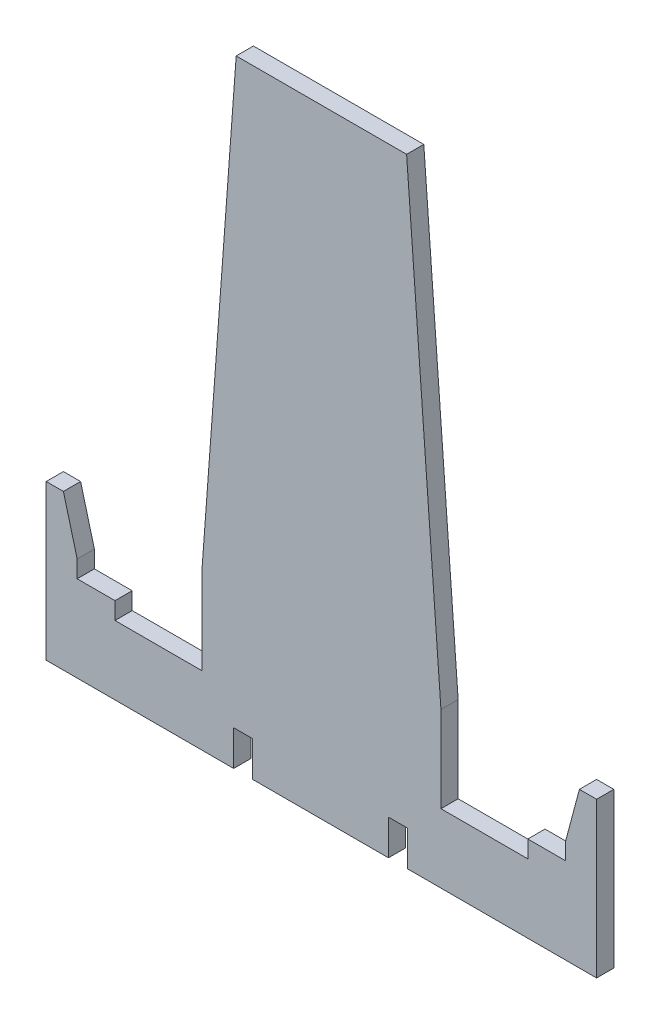
ISO-10303-21;
HEADER;
FILE_DESCRIPTION(('STEP AP214'),'2;1');
FILE_NAME('part.step','',(''),(''),'','','');
FILE_SCHEMA(('AUTOMOTIVE_DESIGN { 1 0 10303 214 1 1 1 1 }'));
ENDSEC;
DATA;
#1=APPLICATION_CONTEXT('core data for automotive mechanical design processes');
#2=APPLICATION_PROTOCOL_DEFINITION('international standard','automotive_design',2000,#1);
#3=PRODUCT_CONTEXT('',#1,'mechanical');
#4=PRODUCT('Part','Part','',(#3));
#5=PRODUCT_RELATED_PRODUCT_CATEGORY('part','',(#4));
#6=PRODUCT_DEFINITION_FORMATION('','',#4);
#7=PRODUCT_DEFINITION_CONTEXT('part definition',#1,'design');
#8=PRODUCT_DEFINITION('design','',#6,#7);
#9=PRODUCT_DEFINITION_SHAPE('','',#8);
#10=(LENGTH_UNIT() NAMED_UNIT(*) SI_UNIT(.MILLI.,.METRE.));
#11=(NAMED_UNIT(*) PLANE_ANGLE_UNIT() SI_UNIT($,.RADIAN.));
#12=(NAMED_UNIT(*) SI_UNIT($,.STERADIAN.) SOLID_ANGLE_UNIT());
#13=UNCERTAINTY_MEASURE_WITH_UNIT(LENGTH_MEASURE(1.E-05),#10,'distance_accuracy_value','');
#14=(GEOMETRIC_REPRESENTATION_CONTEXT(3) GLOBAL_UNCERTAINTY_ASSIGNED_CONTEXT((#13)) GLOBAL_UNIT_ASSIGNED_CONTEXT((#10,
#11,#12)) REPRESENTATION_CONTEXT('',''));
#15=CARTESIAN_POINT('',(0.,0.,0.));
#16=DIRECTION('',(0.,0.,1.));
#17=DIRECTION('',(1.,0.,0.));
#18=AXIS2_PLACEMENT_3D('',#15,#16,#17);
#19=CARTESIAN_POINT('',(-641.00297554201,-133.729086598929,2.5));
#20=DIRECTION('',(1.,0.,0.));
#21=DIRECTION('',(0.,0.,-1.));
#22=AXIS2_PLACEMENT_3D('',#19,#20,#21);
#23=PLANE('',#22);
#24=DIRECTION('',(0.,-1.,0.));
#25=VECTOR('',#24,1.);
#26=CARTESIAN_POINT('',(-641.00297554201,-133.729086598929,-2.5));
#27=LINE('',#26,#25);
#28=CARTESIAN_POINT('',(-641.00297554201,-108.738333191602,-2.5));
#29=VERTEX_POINT('',#28);
#30=CARTESIAN_POINT('',(-641.00297554201,-133.729086598929,-2.5));
#31=VERTEX_POINT('',#30);
#32=EDGE_CURVE('E249',#29,#31,#27,.T.);
#33=ORIENTED_EDGE('',*,*,#32,.T.);
#34=DIRECTION('',(0.,0.,-1.));
#35=VECTOR('',#34,1.);
#36=CARTESIAN_POINT('',(-641.00297554201,-133.729086598929,2.5));
#37=LINE('',#36,#35);
#38=CARTESIAN_POINT('',(-641.00297554201,-133.729086598929,2.5));
#39=VERTEX_POINT('',#38);
#40=EDGE_CURVE('E11',#39,#31,#37,.T.);
#41=ORIENTED_EDGE('',*,*,#40,.F.);
#42=DIRECTION('',(0.,-1.,0.));
#43=VECTOR('',#42,1.);
#44=CARTESIAN_POINT('',(-641.00297554201,-133.729086598929,2.5));
#45=LINE('',#44,#43);
#46=CARTESIAN_POINT('',(-641.00297554201,-108.738333191602,2.5));
#47=VERTEX_POINT('',#46);
#48=EDGE_CURVE('E303',#47,#39,#45,.T.);
#49=ORIENTED_EDGE('',*,*,#48,.F.);
#50=DIRECTION('',(0.,0.,-1.));
#51=VECTOR('',#50,1.);
#52=CARTESIAN_POINT('',(-641.00297554201,-108.738333191602,2.5));
#53=LINE('',#52,#51);
#54=EDGE_CURVE('E245',#47,#29,#53,.T.);
#55=ORIENTED_EDGE('',*,*,#54,.T.);
#56=EDGE_LOOP('',(#33,#41,#49,#55));
#57=FACE_BOUND('',#56,.T.);
#58=ADVANCED_FACE('F33',(#57),#23,.F.);
#59=CARTESIAN_POINT('',(-641.00297554201,-133.729086598929,2.5));
#60=DIRECTION('',(0.,-1.,0.));
#61=DIRECTION('',(0.,0.,-1.));
#62=AXIS2_PLACEMENT_3D('',#59,#60,#61);
#63=PLANE('',#62);
#64=DIRECTION('',(-1.,0.,0.));
#65=VECTOR('',#64,1.);
#66=CARTESIAN_POINT('',(-641.00297554201,-133.729086598929,-2.5));
#67=LINE('',#66,#65);
#68=CARTESIAN_POINT('',(-666.252975542009,-133.729086598929,-2.5));
#69=VERTEX_POINT('',#68);
#70=EDGE_CURVE('E252',#31,#69,#67,.T.);
#71=ORIENTED_EDGE('',*,*,#70,.T.);
#72=DIRECTION('',(0.,0.,-1.));
#73=VECTOR('',#72,1.);
#74=CARTESIAN_POINT('',(-666.252975542009,-133.729086598929,2.5));
#75=LINE('',#74,#73);
#76=CARTESIAN_POINT('',(-666.252975542009,-133.729086598929,2.5));
#77=VERTEX_POINT('',#76);
#78=EDGE_CURVE('E41',#77,#69,#75,.T.);
#79=ORIENTED_EDGE('',*,*,#78,.F.);
#80=DIRECTION('',(-1.,0.,0.));
#81=VECTOR('',#80,1.);
#82=CARTESIAN_POINT('',(-641.00297554201,-133.729086598929,2.5));
#83=LINE('',#82,#81);
#84=EDGE_CURVE('E152',#39,#77,#83,.T.);
#85=ORIENTED_EDGE('',*,*,#84,.F.);
#86=ORIENTED_EDGE('',*,*,#40,.T.);
#87=EDGE_LOOP('',(#71,#79,#85,#86));
#88=FACE_BOUND('',#87,.T.);
#89=ADVANCED_FACE('F461',(#88),#63,.F.);
#90=CARTESIAN_POINT('',(-666.252975542009,-133.729086598929,2.5));
#91=DIRECTION('',(-1.,0.,0.));
#92=DIRECTION('',(0.,0.,1.));
#93=AXIS2_PLACEMENT_3D('',#90,#91,#92);
#94=PLANE('',#93);
#95=DIRECTION('',(0.,1.,0.));
#96=VECTOR('',#95,1.);
#97=CARTESIAN_POINT('',(-666.252975542009,-133.729086598929,-2.5));
#98=LINE('',#97,#96);
#99=CARTESIAN_POINT('',(-666.252975542009,-128.729086598929,-2.5));
#100=VERTEX_POINT('',#99);
#101=EDGE_CURVE('E254',#69,#100,#98,.T.);
#102=ORIENTED_EDGE('',*,*,#101,.T.);
#103=DIRECTION('',(0.,0.,-1.));
#104=VECTOR('',#103,1.);
#105=CARTESIAN_POINT('',(-666.252975542009,-128.729086598929,2.5));
#106=LINE('',#105,#104);
#107=CARTESIAN_POINT('',(-666.252975542009,-128.729086598929,2.5));
#108=VERTEX_POINT('',#107);
#109=EDGE_CURVE('E370',#108,#100,#106,.T.);
#110=ORIENTED_EDGE('',*,*,#109,.F.);
#111=DIRECTION('',(0.,1.,0.));
#112=VECTOR('',#111,1.);
#113=CARTESIAN_POINT('',(-666.252975542009,-133.729086598929,2.5));
#114=LINE('',#113,#112);
#115=EDGE_CURVE('E378',#77,#108,#114,.T.);
#116=ORIENTED_EDGE('',*,*,#115,.F.);
#117=ORIENTED_EDGE('',*,*,#78,.T.);
#118=EDGE_LOOP('',(#102,#110,#116,#117));
#119=FACE_BOUND('',#118,.T.);
#120=ADVANCED_FACE('F376',(#119),#94,.F.);
#121=CARTESIAN_POINT('',(-666.252975542009,-128.729086598929,2.5));
#122=DIRECTION('',(0.,-1.,0.));
#123=DIRECTION('',(0.,0.,-1.));
#124=AXIS2_PLACEMENT_3D('',#121,#122,#123);
#125=PLANE('',#124);
#126=DIRECTION('',(-1.,0.,0.));
#127=VECTOR('',#126,1.);
#128=CARTESIAN_POINT('',(-666.252975542009,-128.729086598929,-2.5));
#129=LINE('',#128,#127);
#130=CARTESIAN_POINT('',(-677.252975542009,-128.729086598929,-2.5));
#131=VERTEX_POINT('',#130);
#132=EDGE_CURVE('E256',#100,#131,#129,.T.);
#133=ORIENTED_EDGE('',*,*,#132,.T.);
#134=DIRECTION('',(0.,0.,-1.));
#135=VECTOR('',#134,1.);
#136=CARTESIAN_POINT('',(-677.252975542009,-128.729086598929,2.5));
#137=LINE('',#136,#135);
#138=CARTESIAN_POINT('',(-677.252975542009,-128.729086598929,2.5));
#139=VERTEX_POINT('',#138);
#140=EDGE_CURVE('E367',#139,#131,#137,.T.);
#141=ORIENTED_EDGE('',*,*,#140,.F.);
#142=DIRECTION('',(-1.,0.,0.));
#143=VECTOR('',#142,1.);
#144=CARTESIAN_POINT('',(-666.252975542009,-128.729086598929,2.5));
#145=LINE('',#144,#143);
#146=EDGE_CURVE('E396',#108,#139,#145,.T.);
#147=ORIENTED_EDGE('',*,*,#146,.F.);
#148=ORIENTED_EDGE('',*,*,#109,.T.);
#149=EDGE_LOOP('',(#133,#141,#147,#148));
#150=FACE_BOUND('',#149,.T.);
#151=ADVANCED_FACE('F387',(#150),#125,.F.);
#152=CARTESIAN_POINT('',(-677.252975542009,-128.729086598929,2.5));
#153=DIRECTION('',(-1.,0.,0.));
#154=DIRECTION('',(0.,0.,1.));
#155=AXIS2_PLACEMENT_3D('',#152,#153,#154);
#156=PLANE('',#155);
#157=DIRECTION('',(0.,1.,0.));
#158=VECTOR('',#157,1.);
#159=CARTESIAN_POINT('',(-677.252975542009,-128.729086598929,-2.5));
#160=LINE('',#159,#158);
#161=CARTESIAN_POINT('',(-677.252975542009,-123.72908659893,-2.5));
#162=VERTEX_POINT('',#161);
#163=EDGE_CURVE('E258',#131,#162,#160,.T.);
#164=ORIENTED_EDGE('',*,*,#163,.T.);
#165=DIRECTION('',(0.,0.,-1.));
#166=VECTOR('',#165,1.);
#167=CARTESIAN_POINT('',(-677.252975542009,-123.72908659893,2.5));
#168=LINE('',#167,#166);
#169=CARTESIAN_POINT('',(-677.252975542009,-123.72908659893,2.5));
#170=VERTEX_POINT('',#169);
#171=EDGE_CURVE('E364',#170,#162,#168,.T.);
#172=ORIENTED_EDGE('',*,*,#171,.F.);
#173=DIRECTION('',(0.,1.,0.));
#174=VECTOR('',#173,1.);
#175=CARTESIAN_POINT('',(-677.252975542009,-128.729086598929,2.5));
#176=LINE('',#175,#174);
#177=EDGE_CURVE('E393',#139,#170,#176,.T.);
#178=ORIENTED_EDGE('',*,*,#177,.F.);
#179=ORIENTED_EDGE('',*,*,#140,.T.);
#180=EDGE_LOOP('',(#164,#172,#178,#179));
#181=FACE_BOUND('',#180,.T.);
#182=ADVANCED_FACE('F391',(#181),#156,.F.);
#183=CARTESIAN_POINT('',(-677.252975542009,-123.72908659893,2.5));
#184=DIRECTION('',(-0.966234939601239,-0.25766265056036,0.));
#185=DIRECTION('',(0.25766265056036,-0.966234939601239,0.));
#186=AXIS2_PLACEMENT_3D('',#183,#184,#185);
#187=PLANE('',#186);
#188=DIRECTION('',(-0.25766265056036,0.966234939601239,0.));
#189=VECTOR('',#188,1.);
#190=CARTESIAN_POINT('',(-677.252975542009,-123.72908659893,-2.5));
#191=LINE('',#190,#189);
#192=CARTESIAN_POINT('',(-681.25297554201,-108.729086598929,-2.5));
#193=VERTEX_POINT('',#192);
#194=EDGE_CURVE('E260',#162,#193,#191,.T.);
#195=ORIENTED_EDGE('',*,*,#194,.T.);
#196=DIRECTION('',(0.,0.,-1.));
#197=VECTOR('',#196,1.);
#198=CARTESIAN_POINT('',(-681.25297554201,-108.729086598929,2.5));
#199=LINE('',#198,#197);
#200=CARTESIAN_POINT('',(-681.25297554201,-108.729086598929,2.5));
#201=VERTEX_POINT('',#200);
#202=EDGE_CURVE('E361',#201,#193,#199,.T.);
#203=ORIENTED_EDGE('',*,*,#202,.F.);
#204=DIRECTION('',(-0.25766265056036,0.966234939601239,0.));
#205=VECTOR('',#204,1.);
#206=CARTESIAN_POINT('',(-677.252975542009,-123.72908659893,2.5));
#207=LINE('',#206,#205);
#208=EDGE_CURVE('E395',#170,#201,#207,.T.);
#209=ORIENTED_EDGE('',*,*,#208,.F.);
#210=ORIENTED_EDGE('',*,*,#171,.T.);
#211=EDGE_LOOP('',(#195,#203,#209,#210));
#212=FACE_BOUND('',#211,.T.);
#213=ADVANCED_FACE('F474',(#212),#187,.F.);
#214=CARTESIAN_POINT('',(-681.25297554201,-108.729086598929,2.5));
#215=DIRECTION('',(0.,-1.,0.));
#216=DIRECTION('',(0.,0.,-1.));
#217=AXIS2_PLACEMENT_3D('',#214,#215,#216);
#218=PLANE('',#217);
#219=DIRECTION('',(-1.,0.,0.));
#220=VECTOR('',#219,1.);
#221=CARTESIAN_POINT('',(-681.25297554201,-108.729086598929,-2.5));
#222=LINE('',#221,#220);
#223=CARTESIAN_POINT('',(-686.25297554201,-108.729086598929,-2.5));
#224=VERTEX_POINT('',#223);
#225=EDGE_CURVE('E262',#193,#224,#222,.T.);
#226=ORIENTED_EDGE('',*,*,#225,.T.);
#227=DIRECTION('',(0.,0.,-1.));
#228=VECTOR('',#227,1.);
#229=CARTESIAN_POINT('',(-686.25297554201,-108.729086598929,2.5));
#230=LINE('',#229,#228);
#231=CARTESIAN_POINT('',(-686.25297554201,-108.729086598929,2.5));
#232=VERTEX_POINT('',#231);
#233=EDGE_CURVE('E358',#232,#224,#230,.T.);
#234=ORIENTED_EDGE('',*,*,#233,.F.);
#235=DIRECTION('',(-1.,0.,0.));
#236=VECTOR('',#235,1.);
#237=CARTESIAN_POINT('',(-681.25297554201,-108.729086598929,2.5));
#238=LINE('',#237,#236);
#239=EDGE_CURVE('E398',#201,#232,#238,.T.);
#240=ORIENTED_EDGE('',*,*,#239,.F.);
#241=ORIENTED_EDGE('',*,*,#202,.T.);
#242=EDGE_LOOP('',(#226,#234,#240,#241));
#243=FACE_BOUND('',#242,.T.);
#244=ADVANCED_FACE('F477',(#243),#218,.F.);
#245=CARTESIAN_POINT('',(-686.25297554201,-108.729086598929,2.5));
#246=DIRECTION('',(1.,0.,0.));
#247=DIRECTION('',(0.,0.,-1.));
#248=AXIS2_PLACEMENT_3D('',#245,#246,#247);
#249=PLANE('',#248);
#250=DIRECTION('',(0.,-1.,0.));
#251=VECTOR('',#250,1.);
#252=CARTESIAN_POINT('',(-686.25297554201,-108.729086598929,-2.5));
#253=LINE('',#252,#251);
#254=CARTESIAN_POINT('',(-686.25297554201,-153.729086598929,-2.5));
#255=VERTEX_POINT('',#254);
#256=EDGE_CURVE('E264',#224,#255,#253,.T.);
#257=ORIENTED_EDGE('',*,*,#256,.T.);
#258=DIRECTION('',(0.,0.,-1.));
#259=VECTOR('',#258,1.);
#260=CARTESIAN_POINT('',(-686.25297554201,-153.729086598929,2.5));
#261=LINE('',#260,#259);
#262=CARTESIAN_POINT('',(-686.25297554201,-153.729086598929,2.5));
#263=VERTEX_POINT('',#262);
#264=EDGE_CURVE('E355',#263,#255,#261,.T.);
#265=ORIENTED_EDGE('',*,*,#264,.F.);
#266=DIRECTION('',(0.,-1.,0.));
#267=VECTOR('',#266,1.);
#268=CARTESIAN_POINT('',(-686.25297554201,-108.729086598929,2.5));
#269=LINE('',#268,#267);
#270=EDGE_CURVE('E404',#232,#263,#269,.T.);
#271=ORIENTED_EDGE('',*,*,#270,.F.);
#272=ORIENTED_EDGE('',*,*,#233,.T.);
#273=EDGE_LOOP('',(#257,#265,#271,#272));
#274=FACE_BOUND('',#273,.T.);
#275=ADVANCED_FACE('F481',(#274),#249,.F.);
#276=CARTESIAN_POINT('',(-686.25297554201,-153.729086598929,2.5));
#277=DIRECTION('',(0.,1.,0.));
#278=DIRECTION('',(0.,0.,1.));
#279=AXIS2_PLACEMENT_3D('',#276,#277,#278);
#280=PLANE('',#279);
#281=DIRECTION('',(1.,0.,0.));
#282=VECTOR('',#281,1.);
#283=CARTESIAN_POINT('',(-686.25297554201,-153.729086598929,-2.5));
#284=LINE('',#283,#282);
#285=CARTESIAN_POINT('',(-631.752975542009,-153.729086598929,-2.5));
#286=VERTEX_POINT('',#285);
#287=EDGE_CURVE('E266',#255,#286,#284,.T.);
#288=ORIENTED_EDGE('',*,*,#287,.T.);
#289=DIRECTION('',(0.,0.,-1.));
#290=VECTOR('',#289,1.);
#291=CARTESIAN_POINT('',(-631.752975542009,-153.729086598929,2.5));
#292=LINE('',#291,#290);
#293=CARTESIAN_POINT('',(-631.752975542009,-153.729086598929,2.5));
#294=VERTEX_POINT('',#293);
#295=EDGE_CURVE('E352',#294,#286,#292,.T.);
#296=ORIENTED_EDGE('',*,*,#295,.F.);
#297=DIRECTION('',(1.,0.,0.));
#298=VECTOR('',#297,1.);
#299=CARTESIAN_POINT('',(-686.25297554201,-153.729086598929,2.5));
#300=LINE('',#299,#298);
#301=EDGE_CURVE('E406',#263,#294,#300,.T.);
#302=ORIENTED_EDGE('',*,*,#301,.F.);
#303=ORIENTED_EDGE('',*,*,#264,.T.);
#304=EDGE_LOOP('',(#288,#296,#302,#303));
#305=FACE_BOUND('',#304,.T.);
#306=ADVANCED_FACE('F485',(#305),#280,.F.);
#307=CARTESIAN_POINT('',(-631.752975542009,-143.479086598928,2.5));
#308=DIRECTION('',(-1.,0.,0.));
#309=DIRECTION('',(0.,0.,1.));
#310=AXIS2_PLACEMENT_3D('',#307,#308,#309);
#311=PLANE('',#310);
#312=DIRECTION('',(0.,1.,0.));
#313=VECTOR('',#312,1.);
#314=CARTESIAN_POINT('',(-631.752975542009,-143.479086598928,-2.5));
#315=LINE('',#314,#313);
#316=CARTESIAN_POINT('',(-631.752975542009,-143.479086598928,-2.5));
#317=VERTEX_POINT('',#316);
#318=EDGE_CURVE('E268',#286,#317,#315,.T.);
#319=ORIENTED_EDGE('',*,*,#318,.T.);
#320=DIRECTION('',(0.,0.,-1.));
#321=VECTOR('',#320,1.);
#322=CARTESIAN_POINT('',(-631.752975542009,-143.479086598928,2.5));
#323=LINE('',#322,#321);
#324=CARTESIAN_POINT('',(-631.752975542009,-143.479086598928,2.5));
#325=VERTEX_POINT('',#324);
#326=EDGE_CURVE('E349',#325,#317,#323,.T.);
#327=ORIENTED_EDGE('',*,*,#326,.F.);
#328=DIRECTION('',(0.,1.,0.));
#329=VECTOR('',#328,1.);
#330=CARTESIAN_POINT('',(-631.752975542009,-143.479086598928,2.5));
#331=LINE('',#330,#329);
#332=EDGE_CURVE('E408',#294,#325,#331,.T.);
#333=ORIENTED_EDGE('',*,*,#332,.F.);
#334=ORIENTED_EDGE('',*,*,#295,.T.);
#335=EDGE_LOOP('',(#319,#327,#333,#334));
#336=FACE_BOUND('',#335,.T.);
#337=ADVANCED_FACE('F489',(#336),#311,.F.);
#338=CARTESIAN_POINT('',(-626.252975542008,-143.479086598928,2.5));
#339=DIRECTION('',(0.,1.,0.));
#340=DIRECTION('',(0.,0.,1.));
#341=AXIS2_PLACEMENT_3D('',#338,#339,#340);
#342=PLANE('',#341);
#343=DIRECTION('',(1.,0.,0.));
#344=VECTOR('',#343,1.);
#345=CARTESIAN_POINT('',(-626.252975542008,-143.479086598928,-2.5));
#346=LINE('',#345,#344);
#347=CARTESIAN_POINT('',(-626.252975542008,-143.479086598928,-2.5));
#348=VERTEX_POINT('',#347);
#349=EDGE_CURVE('E270',#317,#348,#346,.T.);
#350=ORIENTED_EDGE('',*,*,#349,.T.);
#351=DIRECTION('',(0.,0.,-1.));
#352=VECTOR('',#351,1.);
#353=CARTESIAN_POINT('',(-626.252975542008,-143.479086598928,2.5));
#354=LINE('',#353,#352);
#355=CARTESIAN_POINT('',(-626.252975542008,-143.479086598928,2.5));
#356=VERTEX_POINT('',#355);
#357=EDGE_CURVE('E346',#356,#348,#354,.T.);
#358=ORIENTED_EDGE('',*,*,#357,.F.);
#359=DIRECTION('',(1.,0.,0.));
#360=VECTOR('',#359,1.);
#361=CARTESIAN_POINT('',(-626.252975542008,-143.479086598928,2.5));
#362=LINE('',#361,#360);
#363=EDGE_CURVE('E410',#325,#356,#362,.T.);
#364=ORIENTED_EDGE('',*,*,#363,.F.);
#365=ORIENTED_EDGE('',*,*,#326,.T.);
#366=EDGE_LOOP('',(#350,#358,#364,#365));
#367=FACE_BOUND('',#366,.T.);
#368=ADVANCED_FACE('F493',(#367),#342,.F.);
#369=CARTESIAN_POINT('',(-626.252975542008,-153.729086598929,2.5));
#370=DIRECTION('',(1.,0.,0.));
#371=DIRECTION('',(0.,0.,-1.));
#372=AXIS2_PLACEMENT_3D('',#369,#370,#371);
#373=PLANE('',#372);
#374=DIRECTION('',(0.,-1.,0.));
#375=VECTOR('',#374,1.);
#376=CARTESIAN_POINT('',(-626.252975542008,-153.729086598929,-2.5));
#377=LINE('',#376,#375);
#378=CARTESIAN_POINT('',(-626.252975542008,-153.729086598929,-2.5));
#379=VERTEX_POINT('',#378);
#380=EDGE_CURVE('E272',#348,#379,#377,.T.);
#381=ORIENTED_EDGE('',*,*,#380,.T.);
#382=DIRECTION('',(0.,0.,-1.));
#383=VECTOR('',#382,1.);
#384=CARTESIAN_POINT('',(-626.252975542008,-153.729086598929,2.5));
#385=LINE('',#384,#383);
#386=CARTESIAN_POINT('',(-626.252975542008,-153.729086598929,2.5));
#387=VERTEX_POINT('',#386);
#388=EDGE_CURVE('E343',#387,#379,#385,.T.);
#389=ORIENTED_EDGE('',*,*,#388,.F.);
#390=DIRECTION('',(0.,-1.,0.));
#391=VECTOR('',#390,1.);
#392=CARTESIAN_POINT('',(-626.252975542008,-153.729086598929,2.5));
#393=LINE('',#392,#391);
#394=EDGE_CURVE('E412',#356,#387,#393,.T.);
#395=ORIENTED_EDGE('',*,*,#394,.F.);
#396=ORIENTED_EDGE('',*,*,#357,.T.);
#397=EDGE_LOOP('',(#381,#389,#395,#396));
#398=FACE_BOUND('',#397,.T.);
#399=ADVANCED_FACE('F497',(#398),#373,.F.);
#400=CARTESIAN_POINT('',(-626.252975542008,-153.729086598929,2.5));
#401=DIRECTION('',(0.,1.,0.));
#402=DIRECTION('',(0.,0.,1.));
#403=AXIS2_PLACEMENT_3D('',#400,#401,#402);
#404=PLANE('',#403);
#405=DIRECTION('',(1.,0.,0.));
#406=VECTOR('',#405,1.);
#407=CARTESIAN_POINT('',(-626.252975542008,-153.729086598929,-2.5));
#408=LINE('',#407,#406);
#409=CARTESIAN_POINT('',(-586.752975542011,-153.729086598929,-2.5));
#410=VERTEX_POINT('',#409);
#411=EDGE_CURVE('E274',#379,#410,#408,.T.);
#412=ORIENTED_EDGE('',*,*,#411,.T.);
#413=DIRECTION('',(0.,0.,-1.));
#414=VECTOR('',#413,1.);
#415=CARTESIAN_POINT('',(-586.752975542011,-153.729086598929,2.5));
#416=LINE('',#415,#414);
#417=CARTESIAN_POINT('',(-586.752975542011,-153.729086598929,2.5));
#418=VERTEX_POINT('',#417);
#419=EDGE_CURVE('E340',#418,#410,#416,.T.);
#420=ORIENTED_EDGE('',*,*,#419,.F.);
#421=DIRECTION('',(1.,0.,0.));
#422=VECTOR('',#421,1.);
#423=CARTESIAN_POINT('',(-626.252975542008,-153.729086598929,2.5));
#424=LINE('',#423,#422);
#425=EDGE_CURVE('E414',#387,#418,#424,.T.);
#426=ORIENTED_EDGE('',*,*,#425,.F.);
#427=ORIENTED_EDGE('',*,*,#388,.T.);
#428=EDGE_LOOP('',(#412,#420,#426,#427));
#429=FACE_BOUND('',#428,.T.);
#430=ADVANCED_FACE('F501',(#429),#404,.F.);
#431=CARTESIAN_POINT('',(-586.752975542011,-143.479086598928,2.5));
#432=DIRECTION('',(-1.,0.,0.));
#433=DIRECTION('',(0.,0.,1.));
#434=AXIS2_PLACEMENT_3D('',#431,#432,#433);
#435=PLANE('',#434);
#436=DIRECTION('',(0.,1.,0.));
#437=VECTOR('',#436,1.);
#438=CARTESIAN_POINT('',(-586.752975542011,-143.479086598928,-2.5));
#439=LINE('',#438,#437);
#440=CARTESIAN_POINT('',(-586.752975542011,-143.479086598928,-2.5));
#441=VERTEX_POINT('',#440);
#442=EDGE_CURVE('E276',#410,#441,#439,.T.);
#443=ORIENTED_EDGE('',*,*,#442,.T.);
#444=DIRECTION('',(0.,0.,-1.));
#445=VECTOR('',#444,1.);
#446=CARTESIAN_POINT('',(-586.752975542011,-143.479086598928,2.5));
#447=LINE('',#446,#445);
#448=CARTESIAN_POINT('',(-586.752975542011,-143.479086598928,2.5));
#449=VERTEX_POINT('',#448);
#450=EDGE_CURVE('E337',#449,#441,#447,.T.);
#451=ORIENTED_EDGE('',*,*,#450,.F.);
#452=DIRECTION('',(0.,1.,0.));
#453=VECTOR('',#452,1.);
#454=CARTESIAN_POINT('',(-586.752975542011,-143.479086598928,2.5));
#455=LINE('',#454,#453);
#456=EDGE_CURVE('E416',#418,#449,#455,.T.);
#457=ORIENTED_EDGE('',*,*,#456,.F.);
#458=ORIENTED_EDGE('',*,*,#419,.T.);
#459=EDGE_LOOP('',(#443,#451,#457,#458));
#460=FACE_BOUND('',#459,.T.);
#461=ADVANCED_FACE('F505',(#460),#435,.F.);
#462=CARTESIAN_POINT('',(-581.252975542012,-143.479086598928,2.5));
#463=DIRECTION('',(0.,1.,0.));
#464=DIRECTION('',(0.,0.,1.));
#465=AXIS2_PLACEMENT_3D('',#462,#463,#464);
#466=PLANE('',#465);
#467=DIRECTION('',(1.,0.,0.));
#468=VECTOR('',#467,1.);
#469=CARTESIAN_POINT('',(-581.252975542012,-143.479086598928,-2.5));
#470=LINE('',#469,#468);
#471=CARTESIAN_POINT('',(-581.252975542012,-143.479086598928,-2.5));
#472=VERTEX_POINT('',#471);
#473=EDGE_CURVE('E278',#441,#472,#470,.T.);
#474=ORIENTED_EDGE('',*,*,#473,.T.);
#475=DIRECTION('',(0.,0.,-1.));
#476=VECTOR('',#475,1.);
#477=CARTESIAN_POINT('',(-581.252975542012,-143.479086598928,2.5));
#478=LINE('',#477,#476);
#479=CARTESIAN_POINT('',(-581.252975542012,-143.479086598928,2.5));
#480=VERTEX_POINT('',#479);
#481=EDGE_CURVE('E334',#480,#472,#478,.T.);
#482=ORIENTED_EDGE('',*,*,#481,.F.);
#483=DIRECTION('',(1.,0.,0.));
#484=VECTOR('',#483,1.);
#485=CARTESIAN_POINT('',(-581.252975542012,-143.479086598928,2.5));
#486=LINE('',#485,#484);
#487=EDGE_CURVE('E418',#449,#480,#486,.T.);
#488=ORIENTED_EDGE('',*,*,#487,.F.);
#489=ORIENTED_EDGE('',*,*,#450,.T.);
#490=EDGE_LOOP('',(#474,#482,#488,#489));
#491=FACE_BOUND('',#490,.T.);
#492=ADVANCED_FACE('F509',(#491),#466,.F.);
#493=CARTESIAN_POINT('',(-581.252975542012,-153.729086598929,2.5));
#494=DIRECTION('',(1.,0.,0.));
#495=DIRECTION('',(0.,0.,-1.));
#496=AXIS2_PLACEMENT_3D('',#493,#494,#495);
#497=PLANE('',#496);
#498=DIRECTION('',(0.,-1.,0.));
#499=VECTOR('',#498,1.);
#500=CARTESIAN_POINT('',(-581.252975542012,-153.729086598929,-2.5));
#501=LINE('',#500,#499);
#502=CARTESIAN_POINT('',(-581.252975542012,-153.729086598929,-2.5));
#503=VERTEX_POINT('',#502);
#504=EDGE_CURVE('E280',#472,#503,#501,.T.);
#505=ORIENTED_EDGE('',*,*,#504,.T.);
#506=DIRECTION('',(0.,0.,-1.));
#507=VECTOR('',#506,1.);
#508=CARTESIAN_POINT('',(-581.252975542012,-153.729086598929,2.5));
#509=LINE('',#508,#507);
#510=CARTESIAN_POINT('',(-581.252975542012,-153.729086598929,2.5));
#511=VERTEX_POINT('',#510);
#512=EDGE_CURVE('E331',#511,#503,#509,.T.);
#513=ORIENTED_EDGE('',*,*,#512,.F.);
#514=DIRECTION('',(0.,-1.,0.));
#515=VECTOR('',#514,1.);
#516=CARTESIAN_POINT('',(-581.252975542012,-153.729086598929,2.5));
#517=LINE('',#516,#515);
#518=EDGE_CURVE('E420',#480,#511,#517,.T.);
#519=ORIENTED_EDGE('',*,*,#518,.F.);
#520=ORIENTED_EDGE('',*,*,#481,.T.);
#521=EDGE_LOOP('',(#505,#513,#519,#520));
#522=FACE_BOUND('',#521,.T.);
#523=ADVANCED_FACE('F513',(#522),#497,.F.);
#524=CARTESIAN_POINT('',(-526.252975542012,-153.729086598929,2.5));
#525=DIRECTION('',(0.,1.,0.));
#526=DIRECTION('',(0.,0.,1.));
#527=AXIS2_PLACEMENT_3D('',#524,#525,#526);
#528=PLANE('',#527);
#529=DIRECTION('',(1.,0.,0.));
#530=VECTOR('',#529,1.);
#531=CARTESIAN_POINT('',(-526.252975542012,-153.729086598929,-2.5));
#532=LINE('',#531,#530);
#533=CARTESIAN_POINT('',(-526.252975542012,-153.729086598929,-2.5));
#534=VERTEX_POINT('',#533);
#535=EDGE_CURVE('E282',#503,#534,#532,.T.);
#536=ORIENTED_EDGE('',*,*,#535,.T.);
#537=DIRECTION('',(0.,0.,-1.));
#538=VECTOR('',#537,1.);
#539=CARTESIAN_POINT('',(-526.252975542012,-153.729086598929,2.5));
#540=LINE('',#539,#538);
#541=CARTESIAN_POINT('',(-526.252975542012,-153.729086598929,2.5));
#542=VERTEX_POINT('',#541);
#543=EDGE_CURVE('E328',#542,#534,#540,.T.);
#544=ORIENTED_EDGE('',*,*,#543,.F.);
#545=DIRECTION('',(1.,0.,0.));
#546=VECTOR('',#545,1.);
#547=CARTESIAN_POINT('',(-526.252975542012,-153.729086598929,2.5));
#548=LINE('',#547,#546);
#549=EDGE_CURVE('E422',#511,#542,#548,.T.);
#550=ORIENTED_EDGE('',*,*,#549,.F.);
#551=ORIENTED_EDGE('',*,*,#512,.T.);
#552=EDGE_LOOP('',(#536,#544,#550,#551));
#553=FACE_BOUND('',#552,.T.);
#554=ADVANCED_FACE('F517',(#553),#528,.F.);
#555=CARTESIAN_POINT('',(-526.252975542012,-108.729086598929,2.5));
#556=DIRECTION('',(-1.,0.,0.));
#557=DIRECTION('',(0.,0.,1.));
#558=AXIS2_PLACEMENT_3D('',#555,#556,#557);
#559=PLANE('',#558);
#560=DIRECTION('',(0.,1.,0.));
#561=VECTOR('',#560,1.);
#562=CARTESIAN_POINT('',(-526.252975542012,-108.729086598929,-2.5));
#563=LINE('',#562,#561);
#564=CARTESIAN_POINT('',(-526.252975542012,-108.729086598929,-2.5));
#565=VERTEX_POINT('',#564);
#566=EDGE_CURVE('E284',#534,#565,#563,.T.);
#567=ORIENTED_EDGE('',*,*,#566,.T.);
#568=DIRECTION('',(0.,0.,-1.));
#569=VECTOR('',#568,1.);
#570=CARTESIAN_POINT('',(-526.252975542012,-108.729086598929,2.5));
#571=LINE('',#570,#569);
#572=CARTESIAN_POINT('',(-526.252975542012,-108.729086598929,2.5));
#573=VERTEX_POINT('',#572);
#574=EDGE_CURVE('E325',#573,#565,#571,.T.);
#575=ORIENTED_EDGE('',*,*,#574,.F.);
#576=DIRECTION('',(0.,1.,0.));
#577=VECTOR('',#576,1.);
#578=CARTESIAN_POINT('',(-526.252975542012,-108.729086598929,2.5));
#579=LINE('',#578,#577);
#580=EDGE_CURVE('E424',#542,#573,#579,.T.);
#581=ORIENTED_EDGE('',*,*,#580,.F.);
#582=ORIENTED_EDGE('',*,*,#543,.T.);
#583=EDGE_LOOP('',(#567,#575,#581,#582));
#584=FACE_BOUND('',#583,.T.);
#585=ADVANCED_FACE('F521',(#584),#559,.F.);
#586=CARTESIAN_POINT('',(-531.252975542011,-108.729086598929,2.5));
#587=DIRECTION('',(0.,-1.,0.));
#588=DIRECTION('',(0.,0.,-1.));
#589=AXIS2_PLACEMENT_3D('',#586,#587,#588);
#590=PLANE('',#589);
#591=DIRECTION('',(-1.,0.,0.));
#592=VECTOR('',#591,1.);
#593=CARTESIAN_POINT('',(-531.252975542011,-108.729086598929,-2.5));
#594=LINE('',#593,#592);
#595=CARTESIAN_POINT('',(-531.252975542011,-108.729086598929,-2.5));
#596=VERTEX_POINT('',#595);
#597=EDGE_CURVE('E286',#565,#596,#594,.T.);
#598=ORIENTED_EDGE('',*,*,#597,.T.);
#599=DIRECTION('',(0.,0.,-1.));
#600=VECTOR('',#599,1.);
#601=CARTESIAN_POINT('',(-531.252975542011,-108.729086598929,2.5));
#602=LINE('',#601,#600);
#603=CARTESIAN_POINT('',(-531.252975542011,-108.729086598929,2.5));
#604=VERTEX_POINT('',#603);
#605=EDGE_CURVE('E322',#604,#596,#602,.T.);
#606=ORIENTED_EDGE('',*,*,#605,.F.);
#607=DIRECTION('',(-1.,0.,0.));
#608=VECTOR('',#607,1.);
#609=CARTESIAN_POINT('',(-531.252975542011,-108.729086598929,2.5));
#610=LINE('',#609,#608);
#611=EDGE_CURVE('E426',#573,#604,#610,.T.);
#612=ORIENTED_EDGE('',*,*,#611,.F.);
#613=ORIENTED_EDGE('',*,*,#574,.T.);
#614=EDGE_LOOP('',(#598,#606,#612,#613));
#615=FACE_BOUND('',#614,.T.);
#616=ADVANCED_FACE('F525',(#615),#590,.F.);
#617=CARTESIAN_POINT('',(-535.25297554201,-123.729086598929,2.5));
#618=DIRECTION('',(0.96623493960126,-0.257662650560282,0.));
#619=DIRECTION('',(0.257662650560282,0.96623493960126,0.));
#620=AXIS2_PLACEMENT_3D('',#617,#618,#619);
#621=PLANE('',#620);
#622=DIRECTION('',(-0.257662650560282,-0.96623493960126,0.));
#623=VECTOR('',#622,1.);
#624=CARTESIAN_POINT('',(-535.25297554201,-123.729086598929,-2.5));
#625=LINE('',#624,#623);
#626=CARTESIAN_POINT('',(-535.25297554201,-123.729086598929,-2.5));
#627=VERTEX_POINT('',#626);
#628=EDGE_CURVE('E288',#596,#627,#625,.T.);
#629=ORIENTED_EDGE('',*,*,#628,.T.);
#630=DIRECTION('',(0.,0.,-1.));
#631=VECTOR('',#630,1.);
#632=CARTESIAN_POINT('',(-535.25297554201,-123.729086598929,2.5));
#633=LINE('',#632,#631);
#634=CARTESIAN_POINT('',(-535.25297554201,-123.729086598929,2.5));
#635=VERTEX_POINT('',#634);
#636=EDGE_CURVE('E319',#635,#627,#633,.T.);
#637=ORIENTED_EDGE('',*,*,#636,.F.);
#638=DIRECTION('',(-0.257662650560282,-0.96623493960126,0.));
#639=VECTOR('',#638,1.);
#640=CARTESIAN_POINT('',(-535.25297554201,-123.729086598929,2.5));
#641=LINE('',#640,#639);
#642=EDGE_CURVE('E428',#604,#635,#641,.T.);
#643=ORIENTED_EDGE('',*,*,#642,.F.);
#644=ORIENTED_EDGE('',*,*,#605,.T.);
#645=EDGE_LOOP('',(#629,#637,#643,#644));
#646=FACE_BOUND('',#645,.T.);
#647=ADVANCED_FACE('F529',(#646),#621,.F.);
#648=CARTESIAN_POINT('',(-535.25297554201,-128.729086598929,2.5));
#649=DIRECTION('',(1.,0.,0.));
#650=DIRECTION('',(0.,0.,-1.));
#651=AXIS2_PLACEMENT_3D('',#648,#649,#650);
#652=PLANE('',#651);
#653=DIRECTION('',(0.,-1.,0.));
#654=VECTOR('',#653,1.);
#655=CARTESIAN_POINT('',(-535.25297554201,-128.729086598929,-2.5));
#656=LINE('',#655,#654);
#657=CARTESIAN_POINT('',(-535.25297554201,-128.729086598929,-2.5));
#658=VERTEX_POINT('',#657);
#659=EDGE_CURVE('E290',#627,#658,#656,.T.);
#660=ORIENTED_EDGE('',*,*,#659,.T.);
#661=DIRECTION('',(0.,0.,-1.));
#662=VECTOR('',#661,1.);
#663=CARTESIAN_POINT('',(-535.25297554201,-128.729086598929,2.5));
#664=LINE('',#663,#662);
#665=CARTESIAN_POINT('',(-535.25297554201,-128.729086598929,2.5));
#666=VERTEX_POINT('',#665);
#667=EDGE_CURVE('E316',#666,#658,#664,.T.);
#668=ORIENTED_EDGE('',*,*,#667,.F.);
#669=DIRECTION('',(0.,-1.,0.));
#670=VECTOR('',#669,1.);
#671=CARTESIAN_POINT('',(-535.25297554201,-128.729086598929,2.5));
#672=LINE('',#671,#670);
#673=EDGE_CURVE('E430',#635,#666,#672,.T.);
#674=ORIENTED_EDGE('',*,*,#673,.F.);
#675=ORIENTED_EDGE('',*,*,#636,.T.);
#676=EDGE_LOOP('',(#660,#668,#674,#675));
#677=FACE_BOUND('',#676,.T.);
#678=ADVANCED_FACE('F533',(#677),#652,.F.);
#679=CARTESIAN_POINT('',(-546.25297554201,-128.729086598929,2.5));
#680=DIRECTION('',(0.,-1.,0.));
#681=DIRECTION('',(0.,0.,-1.));
#682=AXIS2_PLACEMENT_3D('',#679,#680,#681);
#683=PLANE('',#682);
#684=DIRECTION('',(-1.,0.,0.));
#685=VECTOR('',#684,1.);
#686=CARTESIAN_POINT('',(-546.25297554201,-128.729086598929,-2.5));
#687=LINE('',#686,#685);
#688=CARTESIAN_POINT('',(-546.25297554201,-128.729086598929,-2.5));
#689=VERTEX_POINT('',#688);
#690=EDGE_CURVE('E292',#658,#689,#687,.T.);
#691=ORIENTED_EDGE('',*,*,#690,.T.);
#692=DIRECTION('',(0.,0.,-1.));
#693=VECTOR('',#692,1.);
#694=CARTESIAN_POINT('',(-546.25297554201,-128.729086598929,2.5));
#695=LINE('',#694,#693);
#696=CARTESIAN_POINT('',(-546.25297554201,-128.729086598929,2.5));
#697=VERTEX_POINT('',#696);
#698=EDGE_CURVE('E313',#697,#689,#695,.T.);
#699=ORIENTED_EDGE('',*,*,#698,.F.);
#700=DIRECTION('',(-1.,0.,0.));
#701=VECTOR('',#700,1.);
#702=CARTESIAN_POINT('',(-546.25297554201,-128.729086598929,2.5));
#703=LINE('',#702,#701);
#704=EDGE_CURVE('E432',#666,#697,#703,.T.);
#705=ORIENTED_EDGE('',*,*,#704,.F.);
#706=ORIENTED_EDGE('',*,*,#667,.T.);
#707=EDGE_LOOP('',(#691,#699,#705,#706));
#708=FACE_BOUND('',#707,.T.);
#709=ADVANCED_FACE('F537',(#708),#683,.F.);
#710=CARTESIAN_POINT('',(-546.25297554201,-133.729086598929,2.5));
#711=DIRECTION('',(1.,0.,0.));
#712=DIRECTION('',(0.,0.,-1.));
#713=AXIS2_PLACEMENT_3D('',#710,#711,#712);
#714=PLANE('',#713);
#715=DIRECTION('',(0.,-1.,0.));
#716=VECTOR('',#715,1.);
#717=CARTESIAN_POINT('',(-546.25297554201,-133.729086598929,-2.5));
#718=LINE('',#717,#716);
#719=CARTESIAN_POINT('',(-546.25297554201,-133.729086598929,-2.5));
#720=VERTEX_POINT('',#719);
#721=EDGE_CURVE('E294',#689,#720,#718,.T.);
#722=ORIENTED_EDGE('',*,*,#721,.T.);
#723=DIRECTION('',(0.,0.,-1.));
#724=VECTOR('',#723,1.);
#725=CARTESIAN_POINT('',(-546.25297554201,-133.729086598929,2.5));
#726=LINE('',#725,#724);
#727=CARTESIAN_POINT('',(-546.25297554201,-133.729086598929,2.5));
#728=VERTEX_POINT('',#727);
#729=EDGE_CURVE('E310',#728,#720,#726,.T.);
#730=ORIENTED_EDGE('',*,*,#729,.F.);
#731=DIRECTION('',(0.,-1.,0.));
#732=VECTOR('',#731,1.);
#733=CARTESIAN_POINT('',(-546.25297554201,-133.729086598929,2.5));
#734=LINE('',#733,#732);
#735=EDGE_CURVE('E434',#697,#728,#734,.T.);
#736=ORIENTED_EDGE('',*,*,#735,.F.);
#737=ORIENTED_EDGE('',*,*,#698,.T.);
#738=EDGE_LOOP('',(#722,#730,#736,#737));
#739=FACE_BOUND('',#738,.T.);
#740=ADVANCED_FACE('F541',(#739),#714,.F.);
#741=CARTESIAN_POINT('',(-571.502975542012,-133.729086598929,2.5));
#742=DIRECTION('',(0.,-1.,0.));
#743=DIRECTION('',(0.,0.,-1.));
#744=AXIS2_PLACEMENT_3D('',#741,#742,#743);
#745=PLANE('',#744);
#746=DIRECTION('',(-1.,0.,0.));
#747=VECTOR('',#746,1.);
#748=CARTESIAN_POINT('',(-571.502975542012,-133.729086598929,-2.5));
#749=LINE('',#748,#747);
#750=CARTESIAN_POINT('',(-571.502975542012,-133.729086598929,-2.5));
#751=VERTEX_POINT('',#750);
#752=EDGE_CURVE('E296',#720,#751,#749,.T.);
#753=ORIENTED_EDGE('',*,*,#752,.T.);
#754=DIRECTION('',(0.,0.,-1.));
#755=VECTOR('',#754,1.);
#756=CARTESIAN_POINT('',(-571.502975542012,-133.729086598929,2.5));
#757=LINE('',#756,#755);
#758=CARTESIAN_POINT('',(-571.502975542012,-133.729086598929,2.5));
#759=VERTEX_POINT('',#758);
#760=EDGE_CURVE('E307',#759,#751,#757,.T.);
#761=ORIENTED_EDGE('',*,*,#760,.F.);
#762=DIRECTION('',(-1.,0.,0.));
#763=VECTOR('',#762,1.);
#764=CARTESIAN_POINT('',(-571.502975542012,-133.729086598929,2.5));
#765=LINE('',#764,#763);
#766=EDGE_CURVE('E436',#728,#759,#765,.T.);
#767=ORIENTED_EDGE('',*,*,#766,.F.);
#768=ORIENTED_EDGE('',*,*,#729,.T.);
#769=EDGE_LOOP('',(#753,#761,#767,#768));
#770=FACE_BOUND('',#769,.T.);
#771=ADVANCED_FACE('F442',(#770),#745,.F.);
#772=CARTESIAN_POINT('',(-571.502975542012,-108.738333191602,2.5));
#773=DIRECTION('',(-1.,0.,0.));
#774=DIRECTION('',(0.,0.,1.));
#775=AXIS2_PLACEMENT_3D('',#772,#773,#774);
#776=PLANE('',#775);
#777=DIRECTION('',(0.,1.,0.));
#778=VECTOR('',#777,1.);
#779=CARTESIAN_POINT('',(-571.502975542012,-108.738333191602,-2.5));
#780=LINE('',#779,#778);
#781=CARTESIAN_POINT('',(-571.502975542012,-108.738333191602,-2.5));
#782=VERTEX_POINT('',#781);
#783=EDGE_CURVE('E298',#751,#782,#780,.T.);
#784=ORIENTED_EDGE('',*,*,#783,.T.);
#785=DIRECTION('',(0.,0.,-1.));
#786=VECTOR('',#785,1.);
#787=CARTESIAN_POINT('',(-571.502975542012,-108.738333191602,2.5));
#788=LINE('',#787,#786);
#789=CARTESIAN_POINT('',(-571.502975542012,-108.738333191602,2.5));
#790=VERTEX_POINT('',#789);
#791=EDGE_CURVE('E240',#790,#782,#788,.T.);
#792=ORIENTED_EDGE('',*,*,#791,.F.);
#793=DIRECTION('',(0.,1.,0.));
#794=VECTOR('',#793,1.);
#795=CARTESIAN_POINT('',(-571.502975542012,-108.738333191602,2.5));
#796=LINE('',#795,#794);
#797=EDGE_CURVE('E231',#759,#790,#796,.T.);
#798=ORIENTED_EDGE('',*,*,#797,.F.);
#799=ORIENTED_EDGE('',*,*,#760,.T.);
#800=EDGE_LOOP('',(#784,#792,#798,#799));
#801=FACE_BOUND('',#800,.T.);
#802=ADVANCED_FACE('F446',(#801),#776,.F.);
#803=CARTESIAN_POINT('',(-581.485141956282,26.0209134010707,2.5));
#804=DIRECTION('',(-0.99726775445671,-0.0738716855152989,0.));
#805=DIRECTION('',(0.0738716855152989,-0.99726775445671,0.));
#806=AXIS2_PLACEMENT_3D('',#803,#804,#805);
#807=PLANE('',#806);
#808=DIRECTION('',(-0.0738716855152989,0.99726775445671,0.));
#809=VECTOR('',#808,1.);
#810=CARTESIAN_POINT('',(-581.485141956282,26.0209134010707,-2.5));
#811=LINE('',#810,#809);
#812=CARTESIAN_POINT('',(-581.485141956282,26.0209134010707,-2.5));
#813=VERTEX_POINT('',#812);
#814=EDGE_CURVE('E239',#782,#813,#811,.T.);
#815=ORIENTED_EDGE('',*,*,#814,.T.);
#816=DIRECTION('',(0.,0.,-1.));
#817=VECTOR('',#816,1.);
#818=CARTESIAN_POINT('',(-581.485141956282,26.0209134010707,2.5));
#819=LINE('',#818,#817);
#820=CARTESIAN_POINT('',(-581.485141956282,26.0209134010707,2.5));
#821=VERTEX_POINT('',#820);
#822=EDGE_CURVE('E236',#821,#813,#819,.T.);
#823=ORIENTED_EDGE('',*,*,#822,.F.);
#824=DIRECTION('',(-0.0738716855152989,0.99726775445671,0.));
#825=VECTOR('',#824,1.);
#826=CARTESIAN_POINT('',(-581.485141956282,26.0209134010707,2.5));
#827=LINE('',#826,#825);
#828=EDGE_CURVE('E225',#790,#821,#827,.T.);
#829=ORIENTED_EDGE('',*,*,#828,.F.);
#830=ORIENTED_EDGE('',*,*,#791,.T.);
#831=EDGE_LOOP('',(#815,#823,#829,#830));
#832=FACE_BOUND('',#831,.T.);
#833=ADVANCED_FACE('F237',(#832),#807,.F.);
#834=CARTESIAN_POINT('',(-631.020809127737,26.0209134010707,2.5));
#835=DIRECTION('',(0.,-1.,0.));
#836=DIRECTION('',(0.,0.,-1.));
#837=AXIS2_PLACEMENT_3D('',#834,#835,#836);
#838=PLANE('',#837);
#839=DIRECTION('',(-1.,0.,0.));
#840=VECTOR('',#839,1.);
#841=CARTESIAN_POINT('',(-631.020809127737,26.0209134010707,-2.5));
#842=LINE('',#841,#840);
#843=CARTESIAN_POINT('',(-631.020809127737,26.0209134010707,-2.5));
#844=VERTEX_POINT('',#843);
#845=EDGE_CURVE('E138',#813,#844,#842,.T.);
#846=ORIENTED_EDGE('',*,*,#845,.T.);
#847=DIRECTION('',(0.,0.,-1.));
#848=VECTOR('',#847,1.);
#849=CARTESIAN_POINT('',(-631.020809127737,26.0209134010707,2.5));
#850=LINE('',#849,#848);
#851=CARTESIAN_POINT('',(-631.020809127737,26.0209134010707,2.5));
#852=VERTEX_POINT('',#851);
#853=EDGE_CURVE('E241',#852,#844,#850,.T.);
#854=ORIENTED_EDGE('',*,*,#853,.F.);
#855=DIRECTION('',(-1.,0.,0.));
#856=VECTOR('',#855,1.);
#857=CARTESIAN_POINT('',(-631.020809127737,26.0209134010707,2.5));
#858=LINE('',#857,#856);
#859=EDGE_CURVE('E229',#821,#852,#858,.T.);
#860=ORIENTED_EDGE('',*,*,#859,.F.);
#861=ORIENTED_EDGE('',*,*,#822,.T.);
#862=EDGE_LOOP('',(#846,#854,#860,#861));
#863=FACE_BOUND('',#862,.T.);
#864=ADVANCED_FACE('F243',(#863),#838,.F.);
#865=CARTESIAN_POINT('',(-641.00297554201,-108.738333191602,2.5));
#866=DIRECTION('',(0.997267754456708,-0.073871685515321,0.));
#867=DIRECTION('',(0.073871685515321,0.997267754456708,0.));
#868=AXIS2_PLACEMENT_3D('',#865,#866,#867);
#869=PLANE('',#868);
#870=DIRECTION('',(-0.073871685515321,-0.997267754456708,0.));
#871=VECTOR('',#870,1.);
#872=CARTESIAN_POINT('',(-641.00297554201,-108.738333191602,-2.5));
#873=LINE('',#872,#871);
#874=EDGE_CURVE('E144',#844,#29,#873,.T.);
#875=ORIENTED_EDGE('',*,*,#874,.T.);
#876=ORIENTED_EDGE('',*,*,#54,.F.);
#877=DIRECTION('',(-0.073871685515321,-0.997267754456708,0.));
#878=VECTOR('',#877,1.);
#879=CARTESIAN_POINT('',(-641.00297554201,-108.738333191602,2.5));
#880=LINE('',#879,#878);
#881=EDGE_CURVE('E49',#852,#47,#880,.T.);
#882=ORIENTED_EDGE('',*,*,#881,.F.);
#883=ORIENTED_EDGE('',*,*,#853,.T.);
#884=EDGE_LOOP('',(#875,#876,#882,#883));
#885=FACE_BOUND('',#884,.T.);
#886=ADVANCED_FACE('F450',(#885),#869,.F.);
#887=CARTESIAN_POINT('',(0.,0.,2.5));
#888=DIRECTION('',(0.,0.,-1.));
#889=DIRECTION('',(-1.,0.,0.));
#890=AXIS2_PLACEMENT_3D('',#887,#888,#889);
#891=PLANE('',#890);
#892=ORIENTED_EDGE('',*,*,#48,.T.);
#893=ORIENTED_EDGE('',*,*,#84,.T.);
#894=ORIENTED_EDGE('',*,*,#115,.T.);
#895=ORIENTED_EDGE('',*,*,#146,.T.);
#896=ORIENTED_EDGE('',*,*,#177,.T.);
#897=ORIENTED_EDGE('',*,*,#208,.T.);
#898=ORIENTED_EDGE('',*,*,#239,.T.);
#899=ORIENTED_EDGE('',*,*,#270,.T.);
#900=ORIENTED_EDGE('',*,*,#301,.T.);
#901=ORIENTED_EDGE('',*,*,#332,.T.);
#902=ORIENTED_EDGE('',*,*,#363,.T.);
#903=ORIENTED_EDGE('',*,*,#394,.T.);
#904=ORIENTED_EDGE('',*,*,#425,.T.);
#905=ORIENTED_EDGE('',*,*,#456,.T.);
#906=ORIENTED_EDGE('',*,*,#487,.T.);
#907=ORIENTED_EDGE('',*,*,#518,.T.);
#908=ORIENTED_EDGE('',*,*,#549,.T.);
#909=ORIENTED_EDGE('',*,*,#580,.T.);
#910=ORIENTED_EDGE('',*,*,#611,.T.);
#911=ORIENTED_EDGE('',*,*,#642,.T.);
#912=ORIENTED_EDGE('',*,*,#673,.T.);
#913=ORIENTED_EDGE('',*,*,#704,.T.);
#914=ORIENTED_EDGE('',*,*,#735,.T.);
#915=ORIENTED_EDGE('',*,*,#766,.T.);
#916=ORIENTED_EDGE('',*,*,#797,.T.);
#917=ORIENTED_EDGE('',*,*,#828,.T.);
#918=ORIENTED_EDGE('',*,*,#859,.T.);
#919=ORIENTED_EDGE('',*,*,#881,.T.);
#920=EDGE_LOOP('',(#892,#893,#894,#895,#896,#897,#898,#899,#900,#901,#902,#903,#904,#905,#906,
#907,#908,#909,#910,#911,#912,#913,#914,#915,#916,#917,#918,#919));
#921=FACE_BOUND('',#920,.T.);
#922=ADVANCED_FACE('F227',(#921),#891,.F.);
#923=CARTESIAN_POINT('',(0.,0.,-2.5));
#924=DIRECTION('',(0.,0.,-1.));
#925=DIRECTION('',(-1.,0.,0.));
#926=AXIS2_PLACEMENT_3D('',#923,#924,#925);
#927=PLANE('',#926);
#928=ORIENTED_EDGE('',*,*,#32,.F.);
#929=ORIENTED_EDGE('',*,*,#874,.F.);
#930=ORIENTED_EDGE('',*,*,#845,.F.);
#931=ORIENTED_EDGE('',*,*,#814,.F.);
#932=ORIENTED_EDGE('',*,*,#783,.F.);
#933=ORIENTED_EDGE('',*,*,#752,.F.);
#934=ORIENTED_EDGE('',*,*,#721,.F.);
#935=ORIENTED_EDGE('',*,*,#690,.F.);
#936=ORIENTED_EDGE('',*,*,#659,.F.);
#937=ORIENTED_EDGE('',*,*,#628,.F.);
#938=ORIENTED_EDGE('',*,*,#597,.F.);
#939=ORIENTED_EDGE('',*,*,#566,.F.);
#940=ORIENTED_EDGE('',*,*,#535,.F.);
#941=ORIENTED_EDGE('',*,*,#504,.F.);
#942=ORIENTED_EDGE('',*,*,#473,.F.);
#943=ORIENTED_EDGE('',*,*,#442,.F.);
#944=ORIENTED_EDGE('',*,*,#411,.F.);
#945=ORIENTED_EDGE('',*,*,#380,.F.);
#946=ORIENTED_EDGE('',*,*,#349,.F.);
#947=ORIENTED_EDGE('',*,*,#318,.F.);
#948=ORIENTED_EDGE('',*,*,#287,.F.);
#949=ORIENTED_EDGE('',*,*,#256,.F.);
#950=ORIENTED_EDGE('',*,*,#225,.F.);
#951=ORIENTED_EDGE('',*,*,#194,.F.);
#952=ORIENTED_EDGE('',*,*,#163,.F.);
#953=ORIENTED_EDGE('',*,*,#132,.F.);
#954=ORIENTED_EDGE('',*,*,#101,.F.);
#955=ORIENTED_EDGE('',*,*,#70,.F.);
#956=EDGE_LOOP('',(#928,#929,#930,#931,#932,#933,#934,#935,#936,#937,#938,#939,#940,#941,#942,
#943,#944,#945,#946,#947,#948,#949,#950,#951,#952,#953,#954,#955));
#957=FACE_BOUND('',#956,.T.);
#958=ADVANCED_FACE('F382',(#957),#927,.T.);
#959=CLOSED_SHELL('',(#58,#89,#120,#151,#182,#213,#244,#275,#306,#337,#368,#399,#430,#461,#492,
#523,#554,#585,#616,#647,#678,#709,#740,#771,#802,#833,#864,#886,#922,#958));
#960=MANIFOLD_SOLID_BREP('B2',#959);
#961=ADVANCED_BREP_SHAPE_REPRESENTATION('',(#18,#960),#14);
#962=SHAPE_DEFINITION_REPRESENTATION(#9,#961);
ENDSEC;
END-ISO-10303-21;
